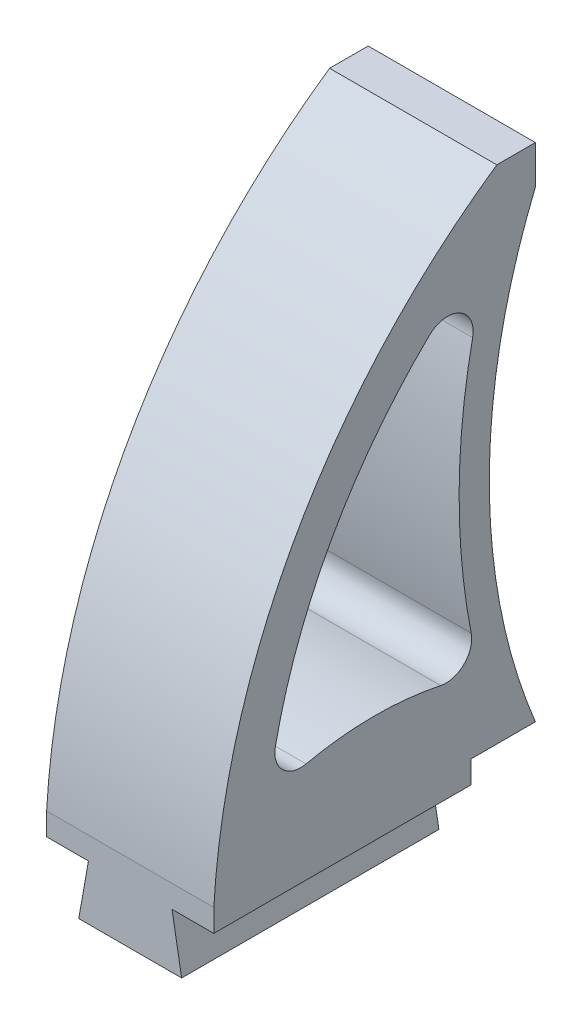
ISO-10303-21;
HEADER;
FILE_DESCRIPTION(('STEP AP214'),'2;1');
FILE_NAME('part.step','',(''),(''),'','','');
FILE_SCHEMA(('AUTOMOTIVE_DESIGN { 1 0 10303 214 1 1 1 1 }'));
ENDSEC;
DATA;
#1=APPLICATION_CONTEXT('core data for automotive mechanical design processes');
#2=APPLICATION_PROTOCOL_DEFINITION('international standard','automotive_design',2000,#1);
#3=PRODUCT_CONTEXT('',#1,'mechanical');
#4=PRODUCT('Part','Part','',(#3));
#5=PRODUCT_RELATED_PRODUCT_CATEGORY('part','',(#4));
#6=PRODUCT_DEFINITION_FORMATION('','',#4);
#7=PRODUCT_DEFINITION_CONTEXT('part definition',#1,'design');
#8=PRODUCT_DEFINITION('design','',#6,#7);
#9=PRODUCT_DEFINITION_SHAPE('','',#8);
#10=(LENGTH_UNIT() NAMED_UNIT(*) SI_UNIT(.MILLI.,.METRE.));
#11=(NAMED_UNIT(*) PLANE_ANGLE_UNIT() SI_UNIT($,.RADIAN.));
#12=(NAMED_UNIT(*) SI_UNIT($,.STERADIAN.) SOLID_ANGLE_UNIT());
#13=UNCERTAINTY_MEASURE_WITH_UNIT(LENGTH_MEASURE(1.E-05),#10,'distance_accuracy_value','');
#14=(GEOMETRIC_REPRESENTATION_CONTEXT(3) GLOBAL_UNCERTAINTY_ASSIGNED_CONTEXT((#13)) GLOBAL_UNIT_ASSIGNED_CONTEXT((#10,
#11,#12)) REPRESENTATION_CONTEXT('',''));
#15=CARTESIAN_POINT('',(0.,0.,0.));
#16=DIRECTION('',(0.,0.,1.));
#17=DIRECTION('',(1.,0.,0.));
#18=AXIS2_PLACEMENT_3D('',#15,#16,#17);
#19=CARTESIAN_POINT('',(6.5,0.,15.7148707184191));
#20=DIRECTION('',(0.,0.,-1.));
#21=DIRECTION('',(-1.,0.,0.));
#22=AXIS2_PLACEMENT_3D('',#19,#20,#21);
#23=PLANE('',#22);
#24=DIRECTION('',(-1.,0.,0.));
#25=VECTOR('',#24,1.);
#26=CARTESIAN_POINT('',(0.,-1.74653863528683,15.7148707184191));
#27=LINE('',#26,#25);
#28=CARTESIAN_POINT('',(6.5,-1.74653863528683,15.7148707184191));
#29=VERTEX_POINT('',#28);
#30=CARTESIAN_POINT('',(3.25,-1.74653863528683,15.7148707184191));
#31=VERTEX_POINT('',#30);
#32=EDGE_CURVE('E220',#29,#31,#27,.T.);
#33=ORIENTED_EDGE('',*,*,#32,.F.);
#34=DIRECTION('',(0.,-1.,0.));
#35=VECTOR('',#34,1.);
#36=CARTESIAN_POINT('',(6.5,0.,15.7148707184191));
#37=LINE('',#36,#35);
#38=CARTESIAN_POINT('',(6.5,0.,15.7148707184191));
#39=VERTEX_POINT('',#38);
#40=EDGE_CURVE('E252',#39,#29,#37,.T.);
#41=ORIENTED_EDGE('',*,*,#40,.F.);
#42=DIRECTION('',(-1.,0.,0.));
#43=VECTOR('',#42,1.);
#44=CARTESIAN_POINT('',(6.5,0.,15.7148707184191));
#45=LINE('',#44,#43);
#46=CARTESIAN_POINT('',(-6.5,0.,15.7148707184191));
#47=VERTEX_POINT('',#46);
#48=EDGE_CURVE('E245',#39,#47,#45,.T.);
#49=ORIENTED_EDGE('',*,*,#48,.T.);
#50=DIRECTION('',(0.,-1.,0.));
#51=VECTOR('',#50,1.);
#52=CARTESIAN_POINT('',(-6.5,0.,15.7148707184191));
#53=LINE('',#52,#51);
#54=CARTESIAN_POINT('',(-6.5,-1.74653863528683,15.7148707184191));
#55=VERTEX_POINT('',#54);
#56=EDGE_CURVE('E267',#47,#55,#53,.T.);
#57=ORIENTED_EDGE('',*,*,#56,.T.);
#58=DIRECTION('',(1.,0.,0.));
#59=VECTOR('',#58,1.);
#60=CARTESIAN_POINT('',(0.,-1.74653863528683,15.7148707184191));
#61=LINE('',#60,#59);
#62=CARTESIAN_POINT('',(-3.25,-1.74653863528683,15.7148707184191));
#63=VERTEX_POINT('',#62);
#64=EDGE_CURVE('E207',#55,#63,#61,.T.);
#65=ORIENTED_EDGE('',*,*,#64,.T.);
#66=DIRECTION('',(-0.173648177666935,-0.984807753012207,0.));
#67=VECTOR('',#66,1.);
#68=CARTESIAN_POINT('',(-2.85332481159478,0.503118149009069,15.7148707184191));
#69=LINE('',#68,#67);
#70=CARTESIAN_POINT('',(-4.,-6.,15.7148707184191));
#71=VERTEX_POINT('',#70);
#72=EDGE_CURVE('E233',#63,#71,#69,.T.);
#73=ORIENTED_EDGE('',*,*,#72,.T.);
#74=DIRECTION('',(-1.,0.,0.));
#75=VECTOR('',#74,1.);
#76=CARTESIAN_POINT('',(6.5,-6.,15.7148707184191));
#77=LINE('',#76,#75);
#78=CARTESIAN_POINT('',(4.,-6.,15.7148707184191));
#79=VERTEX_POINT('',#78);
#80=EDGE_CURVE('E299',#79,#71,#77,.T.);
#81=ORIENTED_EDGE('',*,*,#80,.F.);
#82=DIRECTION('',(0.173648177666935,-0.984807753012207,0.));
#83=VECTOR('',#82,1.);
#84=CARTESIAN_POINT('',(2.85332481159478,0.50311814900907,15.7148707184191));
#85=LINE('',#84,#83);
#86=EDGE_CURVE('E219',#31,#79,#85,.T.);
#87=ORIENTED_EDGE('',*,*,#86,.F.);
#88=EDGE_LOOP('',(#33,#41,#49,#57,#65,#73,#81,#87));
#89=FACE_BOUND('',#88,.T.);
#90=ADVANCED_FACE('F39',(#89),#23,.F.);
#91=CARTESIAN_POINT('',(6.5,-6.,15.7148707184191));
#92=DIRECTION('',(0.,1.,0.));
#93=DIRECTION('',(0.,0.,1.));
#94=AXIS2_PLACEMENT_3D('',#91,#92,#93);
#95=PLANE('',#94);
#96=DIRECTION('',(-1.,0.,0.));
#97=VECTOR('',#96,1.);
#98=CARTESIAN_POINT('',(6.5,-6.,-4.28512928158089));
#99=LINE('',#98,#97);
#100=CARTESIAN_POINT('',(4.,-6.,-4.28512928158089));
#101=VERTEX_POINT('',#100);
#102=CARTESIAN_POINT('',(-4.,-6.,-4.28512928158089));
#103=VERTEX_POINT('',#102);
#104=EDGE_CURVE('E293',#101,#103,#99,.T.);
#105=ORIENTED_EDGE('',*,*,#104,.F.);
#106=DIRECTION('',(0.,0.,1.));
#107=VECTOR('',#106,1.);
#108=CARTESIAN_POINT('',(4.,-6.,-9.28512928158089));
#109=LINE('',#108,#107);
#110=EDGE_CURVE('E230',#101,#79,#109,.T.);
#111=ORIENTED_EDGE('',*,*,#110,.T.);
#112=ORIENTED_EDGE('',*,*,#80,.T.);
#113=DIRECTION('',(0.,0.,1.));
#114=VECTOR('',#113,1.);
#115=CARTESIAN_POINT('',(-4.,-6.,-9.28512928158089));
#116=LINE('',#115,#114);
#117=EDGE_CURVE('E240',#103,#71,#116,.T.);
#118=ORIENTED_EDGE('',*,*,#117,.F.);
#119=EDGE_LOOP('',(#105,#111,#112,#118));
#120=FACE_BOUND('',#119,.T.);
#121=ADVANCED_FACE('F313',(#120),#95,.F.);
#122=CARTESIAN_POINT('',(6.5,-6.,-4.28512928158089));
#123=DIRECTION('',(0.,0.,1.));
#124=DIRECTION('',(1.,0.,0.));
#125=AXIS2_PLACEMENT_3D('',#122,#123,#124);
#126=PLANE('',#125);
#127=DIRECTION('',(0.,1.,0.));
#128=VECTOR('',#127,1.);
#129=CARTESIAN_POINT('',(6.5,-6.,-4.28512928158089));
#130=LINE('',#129,#128);
#131=CARTESIAN_POINT('',(6.5,-1.74653863528683,-4.28512928158089));
#132=VERTEX_POINT('',#131);
#133=CARTESIAN_POINT('',(6.5,0.,-4.28512928158089));
#134=VERTEX_POINT('',#133);
#135=EDGE_CURVE('E258',#132,#134,#130,.T.);
#136=ORIENTED_EDGE('',*,*,#135,.F.);
#137=DIRECTION('',(-1.,0.,0.));
#138=VECTOR('',#137,1.);
#139=CARTESIAN_POINT('',(6.5,-1.74653863528683,-4.28512928158089));
#140=LINE('',#139,#138);
#141=CARTESIAN_POINT('',(3.25,-1.74653863528683,-4.28512928158089));
#142=VERTEX_POINT('',#141);
#143=EDGE_CURVE('E243',#132,#142,#140,.T.);
#144=ORIENTED_EDGE('',*,*,#143,.T.);
#145=DIRECTION('',(0.173648177666935,-0.984807753012207,0.));
#146=VECTOR('',#145,1.);
#147=CARTESIAN_POINT('',(4.07538422401762,-6.4275251791571,-4.28512928158089));
#148=LINE('',#147,#146);
#149=EDGE_CURVE('E11',#142,#101,#148,.T.);
#150=ORIENTED_EDGE('',*,*,#149,.T.);
#151=ORIENTED_EDGE('',*,*,#104,.T.);
#152=DIRECTION('',(-0.173648177666935,-0.984807753012207,0.));
#153=VECTOR('',#152,1.);
#154=CARTESIAN_POINT('',(-3.683386259126,-4.2043942475402,-4.28512928158089));
#155=LINE('',#154,#153);
#156=CARTESIAN_POINT('',(-3.25,-1.74653863528683,-4.28512928158089));
#157=VERTEX_POINT('',#156);
#158=EDGE_CURVE('E50',#157,#103,#155,.T.);
#159=ORIENTED_EDGE('',*,*,#158,.F.);
#160=DIRECTION('',(1.,0.,0.));
#161=VECTOR('',#160,1.);
#162=CARTESIAN_POINT('',(6.5,-1.74653863528683,-4.28512928158089));
#163=LINE('',#162,#161);
#164=CARTESIAN_POINT('',(-6.5,-1.74653863528683,-4.28512928158089));
#165=VERTEX_POINT('',#164);
#166=EDGE_CURVE('E228',#165,#157,#163,.T.);
#167=ORIENTED_EDGE('',*,*,#166,.F.);
#168=DIRECTION('',(0.,1.,0.));
#169=VECTOR('',#168,1.);
#170=CARTESIAN_POINT('',(-6.5,-6.,-4.28512928158089));
#171=LINE('',#170,#169);
#172=CARTESIAN_POINT('',(-6.5,0.,-4.28512928158089));
#173=VERTEX_POINT('',#172);
#174=EDGE_CURVE('E275',#165,#173,#171,.T.);
#175=ORIENTED_EDGE('',*,*,#174,.T.);
#176=DIRECTION('',(-1.,0.,0.));
#177=VECTOR('',#176,1.);
#178=CARTESIAN_POINT('',(6.5,0.,-4.28512928158089));
#179=LINE('',#178,#177);
#180=EDGE_CURVE('E295',#134,#173,#179,.T.);
#181=ORIENTED_EDGE('',*,*,#180,.F.);
#182=EDGE_LOOP('',(#136,#144,#150,#151,#159,#167,#175,#181));
#183=FACE_BOUND('',#182,.T.);
#184=ADVANCED_FACE('F314',(#183),#126,.F.);
#185=CARTESIAN_POINT('',(6.5,-3.,-35.1714929179445));
#186=DIRECTION('',(-1.,0.,0.));
#187=DIRECTION('',(0.,0.,1.));
#188=AXIS2_PLACEMENT_3D('',#185,#186,#187);
#189=CYLINDRICAL_SURFACE('',#188,50.9747192648692);
#190=CARTESIAN_POINT('',(-6.5,-3.,-35.1714929179445));
#191=DIRECTION('',(1.,0.,0.));
#192=DIRECTION('',(0.,0.,-1.));
#193=AXIS2_PLACEMENT_3D('',#190,#191,#192);
#194=CIRCLE('',#193,50.9747192648692);
#195=CARTESIAN_POINT('',(-6.5,39.,-6.28512928158089));
#196=VERTEX_POINT('',#195);
#197=EDGE_CURVE('E249',#196,#47,#194,.T.);
#198=ORIENTED_EDGE('',*,*,#197,.T.);
#199=ORIENTED_EDGE('',*,*,#48,.F.);
#200=CARTESIAN_POINT('',(6.5,-3.,-35.1714929179445));
#201=DIRECTION('',(1.,0.,0.));
#202=DIRECTION('',(0.,0.,-1.));
#203=AXIS2_PLACEMENT_3D('',#200,#201,#202);
#204=CIRCLE('',#203,50.9747192648692);
#205=CARTESIAN_POINT('',(6.5,39.,-6.28512928158089));
#206=VERTEX_POINT('',#205);
#207=EDGE_CURVE('E248',#206,#39,#204,.T.);
#208=ORIENTED_EDGE('',*,*,#207,.F.);
#209=DIRECTION('',(-1.,0.,0.));
#210=VECTOR('',#209,1.);
#211=CARTESIAN_POINT('',(6.5,39.,-6.28512928158089));
#212=LINE('',#211,#210);
#213=EDGE_CURVE('E266',#206,#196,#212,.T.);
#214=ORIENTED_EDGE('',*,*,#213,.T.);
#215=EDGE_LOOP('',(#198,#199,#208,#214));
#216=FACE_BOUND('',#215,.T.);
#217=ADVANCED_FACE('F41',(#216),#189,.T.);
#218=CARTESIAN_POINT('',(6.5,0.,-4.28512928158089));
#219=DIRECTION('',(0.,1.,0.));
#220=DIRECTION('',(0.,0.,1.));
#221=AXIS2_PLACEMENT_3D('',#218,#219,#220);
#222=PLANE('',#221);
#223=DIRECTION('',(0.,0.,-1.));
#224=VECTOR('',#223,1.);
#225=CARTESIAN_POINT('',(-6.5,0.,-4.28512928158089));
#226=LINE('',#225,#224);
#227=CARTESIAN_POINT('',(-6.5,0.,-9.28512928158089));
#228=VERTEX_POINT('',#227);
#229=EDGE_CURVE('E273',#173,#228,#226,.T.);
#230=ORIENTED_EDGE('',*,*,#229,.T.);
#231=DIRECTION('',(-1.,0.,0.));
#232=VECTOR('',#231,1.);
#233=CARTESIAN_POINT('',(6.5,0.,-9.28512928158089));
#234=LINE('',#233,#232);
#235=CARTESIAN_POINT('',(6.5,0.,-9.28512928158089));
#236=VERTEX_POINT('',#235);
#237=EDGE_CURVE('E288',#236,#228,#234,.T.);
#238=ORIENTED_EDGE('',*,*,#237,.F.);
#239=DIRECTION('',(0.,0.,-1.));
#240=VECTOR('',#239,1.);
#241=CARTESIAN_POINT('',(6.5,0.,-4.28512928158089));
#242=LINE('',#241,#240);
#243=EDGE_CURVE('E256',#134,#236,#242,.T.);
#244=ORIENTED_EDGE('',*,*,#243,.F.);
#245=ORIENTED_EDGE('',*,*,#180,.T.);
#246=EDGE_LOOP('',(#230,#238,#244,#245));
#247=FACE_BOUND('',#246,.T.);
#248=ADVANCED_FACE('F334',(#247),#222,.F.);
#249=CARTESIAN_POINT('',(6.5,18.,-52.7017159737657));
#250=DIRECTION('',(-1.,0.,0.));
#251=DIRECTION('',(0.,0.,1.));
#252=AXIS2_PLACEMENT_3D('',#249,#250,#251);
#253=CYLINDRICAL_SURFACE('',#252,47.);
#254=CARTESIAN_POINT('',(-6.5,18.,-52.7017159737657));
#255=DIRECTION('',(-1.,0.,0.));
#256=DIRECTION('',(0.,0.,-1.));
#257=AXIS2_PLACEMENT_3D('',#254,#255,#256);
#258=CIRCLE('',#257,47.);
#259=CARTESIAN_POINT('',(-6.5,36.,-9.28512928158089));
#260=VERTEX_POINT('',#259);
#261=EDGE_CURVE('E277',#228,#260,#258,.T.);
#262=ORIENTED_EDGE('',*,*,#261,.T.);
#263=DIRECTION('',(-1.,0.,0.));
#264=VECTOR('',#263,1.);
#265=CARTESIAN_POINT('',(6.5,36.,-9.28512928158089));
#266=LINE('',#265,#264);
#267=CARTESIAN_POINT('',(6.5,36.,-9.28512928158089));
#268=VERTEX_POINT('',#267);
#269=EDGE_CURVE('E286',#268,#260,#266,.T.);
#270=ORIENTED_EDGE('',*,*,#269,.F.);
#271=CARTESIAN_POINT('',(6.5,18.,-52.7017159737657));
#272=DIRECTION('',(-1.,0.,0.));
#273=DIRECTION('',(0.,0.,-1.));
#274=AXIS2_PLACEMENT_3D('',#271,#272,#273);
#275=CIRCLE('',#274,47.);
#276=EDGE_CURVE('E257',#236,#268,#275,.T.);
#277=ORIENTED_EDGE('',*,*,#276,.F.);
#278=ORIENTED_EDGE('',*,*,#237,.T.);
#279=EDGE_LOOP('',(#262,#270,#277,#278));
#280=FACE_BOUND('',#279,.T.);
#281=ADVANCED_FACE('F354',(#280),#253,.F.);
#282=CARTESIAN_POINT('',(6.5,39.,-9.28512928158089));
#283=DIRECTION('',(0.,0.,1.));
#284=DIRECTION('',(1.,0.,0.));
#285=AXIS2_PLACEMENT_3D('',#282,#283,#284);
#286=PLANE('',#285);
#287=DIRECTION('',(0.,1.,0.));
#288=VECTOR('',#287,1.);
#289=CARTESIAN_POINT('',(-6.5,39.,-9.28512928158089));
#290=LINE('',#289,#288);
#291=CARTESIAN_POINT('',(-6.5,39.,-9.28512928158089));
#292=VERTEX_POINT('',#291);
#293=EDGE_CURVE('E279',#260,#292,#290,.T.);
#294=ORIENTED_EDGE('',*,*,#293,.T.);
#295=DIRECTION('',(-1.,0.,0.));
#296=VECTOR('',#295,1.);
#297=CARTESIAN_POINT('',(6.5,39.,-9.28512928158089));
#298=LINE('',#297,#296);
#299=CARTESIAN_POINT('',(6.5,39.,-9.28512928158089));
#300=VERTEX_POINT('',#299);
#301=EDGE_CURVE('E284',#300,#292,#298,.T.);
#302=ORIENTED_EDGE('',*,*,#301,.F.);
#303=DIRECTION('',(0.,1.,0.));
#304=VECTOR('',#303,1.);
#305=CARTESIAN_POINT('',(6.5,39.,-9.28512928158089));
#306=LINE('',#305,#304);
#307=EDGE_CURVE('E265',#268,#300,#306,.T.);
#308=ORIENTED_EDGE('',*,*,#307,.F.);
#309=ORIENTED_EDGE('',*,*,#269,.T.);
#310=EDGE_LOOP('',(#294,#302,#308,#309));
#311=FACE_BOUND('',#310,.T.);
#312=ADVANCED_FACE('F352',(#311),#286,.F.);
#313=CARTESIAN_POINT('',(6.5,39.,-6.28512928158089));
#314=DIRECTION('',(0.,-1.,0.));
#315=DIRECTION('',(0.,0.,-1.));
#316=AXIS2_PLACEMENT_3D('',#313,#314,#315);
#317=PLANE('',#316);
#318=DIRECTION('',(0.,0.,1.));
#319=VECTOR('',#318,1.);
#320=CARTESIAN_POINT('',(-6.5,39.,-6.28512928158089));
#321=LINE('',#320,#319);
#322=EDGE_CURVE('E251',#292,#196,#321,.T.);
#323=ORIENTED_EDGE('',*,*,#322,.T.);
#324=ORIENTED_EDGE('',*,*,#213,.F.);
#325=DIRECTION('',(0.,0.,1.));
#326=VECTOR('',#325,1.);
#327=CARTESIAN_POINT('',(6.5,39.,-6.28512928158089));
#328=LINE('',#327,#326);
#329=EDGE_CURVE('E262',#300,#206,#328,.T.);
#330=ORIENTED_EDGE('',*,*,#329,.F.);
#331=ORIENTED_EDGE('',*,*,#301,.T.);
#332=EDGE_LOOP('',(#323,#324,#330,#331));
#333=FACE_BOUND('',#332,.T.);
#334=ADVANCED_FACE('F347',(#333),#317,.F.);
#335=CARTESIAN_POINT('',(6.5,-3.,-35.1714929179445));
#336=DIRECTION('',(1.,0.,0.));
#337=DIRECTION('',(0.,0.,-1.));
#338=AXIS2_PLACEMENT_3D('',#335,#336,#337);
#339=PLANE('',#338);
#340=CARTESIAN_POINT('',(6.5,18.1044855795233,-53.3554270520869));
#341=DIRECTION('',(1.,0.,0.));
#342=DIRECTION('',(0.,0.,-1.));
#343=AXIS2_PLACEMENT_3D('',#340,#341,#342);
#344=CIRCLE('',#343,50.);
#345=CARTESIAN_POINT('',(6.5,8.46382033311857,-4.29365401434632));
#346=VERTEX_POINT('',#345);
#347=CARTESIAN_POINT('',(6.5,28.3028962432529,-4.40655147834228));
#348=VERTEX_POINT('',#347);
#349=EDGE_CURVE('E53',#346,#348,#344,.F.);
#350=ORIENTED_EDGE('',*,*,#349,.F.);
#351=CARTESIAN_POINT('',(6.5,8.07819372326239,-2.33118309283669));
#352=DIRECTION('',(1.,0.,0.));
#353=DIRECTION('',(0.,0.,-1.));
#354=AXIS2_PLACEMENT_3D('',#351,#352,#353);
#355=CIRCLE('',#354,2.);
#356=CARTESIAN_POINT('',(6.5,6.12084145223873,-1.92036429200293));
#357=VERTEX_POINT('',#356);
#358=EDGE_CURVE('E184',#357,#346,#355,.T.);
#359=ORIENTED_EDGE('',*,*,#358,.F.);
#360=CARTESIAN_POINT('',(6.5,-18.3460619355571,3.21487071841911));
#361=DIRECTION('',(1.,0.,0.));
#362=DIRECTION('',(0.,0.,-1.));
#363=AXIS2_PLACEMENT_3D('',#360,#361,#362);
#364=CIRCLE('',#363,25.);
#365=CARTESIAN_POINT('',(6.5,6.07909507049784,8.54513386666655));
#366=VERTEX_POINT('',#365);
#367=EDGE_CURVE('E190',#366,#357,#364,.F.);
#368=ORIENTED_EDGE('',*,*,#367,.F.);
#369=CARTESIAN_POINT('',(6.5,8.03310763098224,8.97155491852634));
#370=DIRECTION('',(1.,0.,0.));
#371=DIRECTION('',(0.,0.,-1.));
#372=AXIS2_PLACEMENT_3D('',#369,#370,#371);
#373=CIRCLE('',#372,2.);
#374=CARTESIAN_POINT('',(6.5,8.43997010255349,10.9297333907875));
#375=VERTEX_POINT('',#374);
#376=EDGE_CURVE('E205',#366,#375,#373,.F.);
#377=ORIENTED_EDGE('',*,*,#376,.T.);
#378=CARTESIAN_POINT('',(6.5,-0.104141800442669,-30.1920145266963));
#379=DIRECTION('',(1.,0.,0.));
#380=DIRECTION('',(0.,0.,-1.));
#381=AXIS2_PLACEMENT_3D('',#378,#379,#380);
#382=CIRCLE('',#381,42.);
#383=CARTESIAN_POINT('',(6.5,30.1515813933143,-1.06142555182731));
#384=VERTEX_POINT('',#383);
#385=EDGE_CURVE('E200',#384,#375,#382,.T.);
#386=ORIENTED_EDGE('',*,*,#385,.F.);
#387=CARTESIAN_POINT('',(6.5,28.7108326698021,-2.4485964553925));
#388=DIRECTION('',(1.,0.,0.));
#389=DIRECTION('',(0.,0.,-1.));
#390=AXIS2_PLACEMENT_3D('',#387,#388,#389);
#391=CIRCLE('',#390,2.);
#392=EDGE_CURVE('E197',#348,#384,#391,.T.);
#393=ORIENTED_EDGE('',*,*,#392,.F.);
#394=EDGE_LOOP('',(#350,#359,#368,#377,#386,#393));
#395=FACE_BOUND('',#394,.T.);
#396=DIRECTION('',(0.,0.,1.));
#397=VECTOR('',#396,1.);
#398=CARTESIAN_POINT('',(6.5,-1.74653863528683,-9.28512928158089));
#399=LINE('',#398,#397);
#400=EDGE_CURVE('E221',#132,#29,#399,.T.);
#401=ORIENTED_EDGE('',*,*,#400,.F.);
#402=ORIENTED_EDGE('',*,*,#135,.T.);
#403=ORIENTED_EDGE('',*,*,#243,.T.);
#404=ORIENTED_EDGE('',*,*,#276,.T.);
#405=ORIENTED_EDGE('',*,*,#307,.T.);
#406=ORIENTED_EDGE('',*,*,#329,.T.);
#407=ORIENTED_EDGE('',*,*,#207,.T.);
#408=ORIENTED_EDGE('',*,*,#40,.T.);
#409=EDGE_LOOP('',(#401,#402,#403,#404,#405,#406,#407,#408));
#410=FACE_BOUND('',#409,.T.);
#411=ADVANCED_FACE('F340',(#395,#410),#339,.T.);
#412=CARTESIAN_POINT('',(-6.5,-3.,-35.1714929179445));
#413=DIRECTION('',(1.,0.,0.));
#414=DIRECTION('',(0.,0.,-1.));
#415=AXIS2_PLACEMENT_3D('',#412,#413,#414);
#416=PLANE('',#415);
#417=CARTESIAN_POINT('',(-6.5,8.07819372326239,-2.33118309283669));
#418=DIRECTION('',(1.,0.,0.));
#419=DIRECTION('',(0.,0.,-1.));
#420=AXIS2_PLACEMENT_3D('',#417,#418,#419);
#421=CIRCLE('',#420,2.);
#422=CARTESIAN_POINT('',(-6.5,6.12084145223873,-1.92036429200293));
#423=VERTEX_POINT('',#422);
#424=CARTESIAN_POINT('',(-6.5,8.46382033311857,-4.29365401434632));
#425=VERTEX_POINT('',#424);
#426=EDGE_CURVE('E174',#423,#425,#421,.T.);
#427=ORIENTED_EDGE('',*,*,#426,.T.);
#428=CARTESIAN_POINT('',(-6.5,18.1044855795233,-53.3554270520869));
#429=DIRECTION('',(1.,0.,0.));
#430=DIRECTION('',(0.,0.,-1.));
#431=AXIS2_PLACEMENT_3D('',#428,#429,#430);
#432=CIRCLE('',#431,50.);
#433=CARTESIAN_POINT('',(-6.5,28.3028962432529,-4.40655147834228));
#434=VERTEX_POINT('',#433);
#435=EDGE_CURVE('E170',#425,#434,#432,.F.);
#436=ORIENTED_EDGE('',*,*,#435,.T.);
#437=CARTESIAN_POINT('',(-6.5,28.7108326698021,-2.4485964553925));
#438=DIRECTION('',(1.,0.,0.));
#439=DIRECTION('',(0.,0.,-1.));
#440=AXIS2_PLACEMENT_3D('',#437,#438,#439);
#441=CIRCLE('',#440,2.);
#442=CARTESIAN_POINT('',(-6.5,30.1515813933143,-1.06142555182732));
#443=VERTEX_POINT('',#442);
#444=EDGE_CURVE('E176',#434,#443,#441,.T.);
#445=ORIENTED_EDGE('',*,*,#444,.T.);
#446=CARTESIAN_POINT('',(-6.5,-0.104141800442669,-30.1920145266963));
#447=DIRECTION('',(1.,0.,0.));
#448=DIRECTION('',(0.,0.,-1.));
#449=AXIS2_PLACEMENT_3D('',#446,#447,#448);
#450=CIRCLE('',#449,42.);
#451=CARTESIAN_POINT('',(-6.5,8.43997010255349,10.9297333907875));
#452=VERTEX_POINT('',#451);
#453=EDGE_CURVE('E65',#443,#452,#450,.T.);
#454=ORIENTED_EDGE('',*,*,#453,.T.);
#455=CARTESIAN_POINT('',(-6.5,8.03310763098224,8.97155491852634));
#456=DIRECTION('',(1.,0.,0.));
#457=DIRECTION('',(0.,0.,-1.));
#458=AXIS2_PLACEMENT_3D('',#455,#456,#457);
#459=CIRCLE('',#458,2.);
#460=CARTESIAN_POINT('',(-6.5,6.07909507049784,8.54513386666655));
#461=VERTEX_POINT('',#460);
#462=EDGE_CURVE('E191',#461,#452,#459,.F.);
#463=ORIENTED_EDGE('',*,*,#462,.F.);
#464=CARTESIAN_POINT('',(-6.5,-18.3460619355571,3.21487071841911));
#465=DIRECTION('',(1.,0.,0.));
#466=DIRECTION('',(0.,0.,-1.));
#467=AXIS2_PLACEMENT_3D('',#464,#465,#466);
#468=CIRCLE('',#467,25.);
#469=EDGE_CURVE('E194',#461,#423,#468,.F.);
#470=ORIENTED_EDGE('',*,*,#469,.T.);
#471=EDGE_LOOP('',(#427,#436,#445,#454,#463,#470));
#472=FACE_BOUND('',#471,.T.);
#473=ORIENTED_EDGE('',*,*,#174,.F.);
#474=DIRECTION('',(0.,0.,1.));
#475=VECTOR('',#474,1.);
#476=CARTESIAN_POINT('',(-6.5,-1.74653863528683,-9.28512928158089));
#477=LINE('',#476,#475);
#478=EDGE_CURVE('E227',#165,#55,#477,.T.);
#479=ORIENTED_EDGE('',*,*,#478,.T.);
#480=ORIENTED_EDGE('',*,*,#56,.F.);
#481=ORIENTED_EDGE('',*,*,#197,.F.);
#482=ORIENTED_EDGE('',*,*,#322,.F.);
#483=ORIENTED_EDGE('',*,*,#293,.F.);
#484=ORIENTED_EDGE('',*,*,#261,.F.);
#485=ORIENTED_EDGE('',*,*,#229,.F.);
#486=EDGE_LOOP('',(#473,#479,#480,#481,#482,#483,#484,#485));
#487=FACE_BOUND('',#486,.T.);
#488=ADVANCED_FACE('F180',(#472,#487),#416,.F.);
#489=CARTESIAN_POINT('',(-2.85332481159478,0.503118149009069,-9.28512928158089));
#490=DIRECTION('',(-0.984807753012207,0.173648177666935,0.));
#491=DIRECTION('',(-0.173648177666935,-0.984807753012207,0.));
#492=AXIS2_PLACEMENT_3D('',#489,#490,#491);
#493=PLANE('',#492);
#494=ORIENTED_EDGE('',*,*,#158,.T.);
#495=ORIENTED_EDGE('',*,*,#117,.T.);
#496=ORIENTED_EDGE('',*,*,#72,.F.);
#497=DIRECTION('',(0.,0.,1.));
#498=VECTOR('',#497,1.);
#499=CARTESIAN_POINT('',(-3.25,-1.74653863528683,-9.28512928158089));
#500=LINE('',#499,#498);
#501=EDGE_CURVE('E222',#157,#63,#500,.T.);
#502=ORIENTED_EDGE('',*,*,#501,.F.);
#503=EDGE_LOOP('',(#494,#495,#496,#502));
#504=FACE_BOUND('',#503,.T.);
#505=ADVANCED_FACE('F305',(#504),#493,.T.);
#506=CARTESIAN_POINT('',(0.,-1.74653863528683,-9.28512928158089));
#507=DIRECTION('',(0.,-1.,0.));
#508=DIRECTION('',(1.,0.,0.));
#509=AXIS2_PLACEMENT_3D('',#506,#507,#508);
#510=PLANE('',#509);
#511=ORIENTED_EDGE('',*,*,#166,.T.);
#512=ORIENTED_EDGE('',*,*,#501,.T.);
#513=ORIENTED_EDGE('',*,*,#64,.F.);
#514=ORIENTED_EDGE('',*,*,#478,.F.);
#515=EDGE_LOOP('',(#511,#512,#513,#514));
#516=FACE_BOUND('',#515,.T.);
#517=ADVANCED_FACE('F324',(#516),#510,.T.);
#518=CARTESIAN_POINT('',(2.85332481159478,0.50311814900907,-9.28512928158089));
#519=DIRECTION('',(-0.984807753012207,-0.173648177666935,0.));
#520=DIRECTION('',(0.173648177666935,-0.984807753012207,0.));
#521=AXIS2_PLACEMENT_3D('',#518,#519,#520);
#522=PLANE('',#521);
#523=DIRECTION('',(0.,0.,1.));
#524=VECTOR('',#523,1.);
#525=CARTESIAN_POINT('',(3.25,-1.74653863528683,-9.28512928158089));
#526=LINE('',#525,#524);
#527=EDGE_CURVE('E224',#142,#31,#526,.T.);
#528=ORIENTED_EDGE('',*,*,#527,.T.);
#529=ORIENTED_EDGE('',*,*,#86,.T.);
#530=ORIENTED_EDGE('',*,*,#110,.F.);
#531=ORIENTED_EDGE('',*,*,#149,.F.);
#532=EDGE_LOOP('',(#528,#529,#530,#531));
#533=FACE_BOUND('',#532,.T.);
#534=ADVANCED_FACE('F320',(#533),#522,.F.);
#535=CARTESIAN_POINT('',(0.,-1.74653863528683,-9.28512928158089));
#536=DIRECTION('',(0.,1.,0.));
#537=DIRECTION('',(-1.,0.,0.));
#538=AXIS2_PLACEMENT_3D('',#535,#536,#537);
#539=PLANE('',#538);
#540=ORIENTED_EDGE('',*,*,#400,.T.);
#541=ORIENTED_EDGE('',*,*,#32,.T.);
#542=ORIENTED_EDGE('',*,*,#527,.F.);
#543=ORIENTED_EDGE('',*,*,#143,.F.);
#544=EDGE_LOOP('',(#540,#541,#542,#543));
#545=FACE_BOUND('',#544,.T.);
#546=ADVANCED_FACE('F317',(#545),#539,.F.);
#547=CARTESIAN_POINT('',(-6.5,18.1044855795233,-53.3554270520869));
#548=DIRECTION('',(1.,0.,0.));
#549=DIRECTION('',(0.,0.,-1.));
#550=AXIS2_PLACEMENT_3D('',#547,#548,#549);
#551=CYLINDRICAL_SURFACE('',#550,50.);
#552=ORIENTED_EDGE('',*,*,#349,.T.);
#553=DIRECTION('',(1.,0.,0.));
#554=VECTOR('',#553,1.);
#555=CARTESIAN_POINT('',(-6.5,28.3028962432529,-4.40655147834228));
#556=LINE('',#555,#554);
#557=EDGE_CURVE('E162',#434,#348,#556,.T.);
#558=ORIENTED_EDGE('',*,*,#557,.F.);
#559=ORIENTED_EDGE('',*,*,#435,.F.);
#560=DIRECTION('',(1.,0.,0.));
#561=VECTOR('',#560,1.);
#562=CARTESIAN_POINT('',(-6.5,8.46382033311857,-4.29365401434632));
#563=LINE('',#562,#561);
#564=EDGE_CURVE('E210',#425,#346,#563,.T.);
#565=ORIENTED_EDGE('',*,*,#564,.T.);
#566=EDGE_LOOP('',(#552,#558,#559,#565));
#567=FACE_BOUND('',#566,.T.);
#568=ADVANCED_FACE('F164',(#567),#551,.T.);
#569=CARTESIAN_POINT('',(-6.5,8.07819372326239,-2.33118309283669));
#570=DIRECTION('',(1.,0.,0.));
#571=DIRECTION('',(0.,0.,-1.));
#572=AXIS2_PLACEMENT_3D('',#569,#570,#571);
#573=CYLINDRICAL_SURFACE('',#572,2.);
#574=ORIENTED_EDGE('',*,*,#358,.T.);
#575=ORIENTED_EDGE('',*,*,#564,.F.);
#576=ORIENTED_EDGE('',*,*,#426,.F.);
#577=DIRECTION('',(1.,0.,0.));
#578=VECTOR('',#577,1.);
#579=CARTESIAN_POINT('',(-6.5,6.12084145223873,-1.92036429200293));
#580=LINE('',#579,#578);
#581=EDGE_CURVE('E209',#423,#357,#580,.T.);
#582=ORIENTED_EDGE('',*,*,#581,.T.);
#583=EDGE_LOOP('',(#574,#575,#576,#582));
#584=FACE_BOUND('',#583,.T.);
#585=ADVANCED_FACE('F468',(#584),#573,.F.);
#586=CARTESIAN_POINT('',(-6.5,-18.3460619355571,3.21487071841911));
#587=DIRECTION('',(1.,0.,0.));
#588=DIRECTION('',(0.,0.,-1.));
#589=AXIS2_PLACEMENT_3D('',#586,#587,#588);
#590=CYLINDRICAL_SURFACE('',#589,25.);
#591=ORIENTED_EDGE('',*,*,#367,.T.);
#592=ORIENTED_EDGE('',*,*,#581,.F.);
#593=ORIENTED_EDGE('',*,*,#469,.F.);
#594=DIRECTION('',(1.,0.,0.));
#595=VECTOR('',#594,1.);
#596=CARTESIAN_POINT('',(-6.5,6.07909507049784,8.54513386666655));
#597=LINE('',#596,#595);
#598=EDGE_CURVE('E215',#461,#366,#597,.T.);
#599=ORIENTED_EDGE('',*,*,#598,.T.);
#600=EDGE_LOOP('',(#591,#592,#593,#599));
#601=FACE_BOUND('',#600,.T.);
#602=ADVANCED_FACE('F476',(#601),#590,.T.);
#603=CARTESIAN_POINT('',(-6.5,8.03310763098224,8.97155491852634));
#604=DIRECTION('',(1.,0.,0.));
#605=DIRECTION('',(0.,0.,-1.));
#606=AXIS2_PLACEMENT_3D('',#603,#604,#605);
#607=CYLINDRICAL_SURFACE('',#606,2.);
#608=ORIENTED_EDGE('',*,*,#376,.F.);
#609=ORIENTED_EDGE('',*,*,#598,.F.);
#610=ORIENTED_EDGE('',*,*,#462,.T.);
#611=DIRECTION('',(1.,0.,0.));
#612=VECTOR('',#611,1.);
#613=CARTESIAN_POINT('',(-6.5,8.43997010255349,10.9297333907875));
#614=LINE('',#613,#612);
#615=EDGE_CURVE('E212',#452,#375,#614,.T.);
#616=ORIENTED_EDGE('',*,*,#615,.T.);
#617=EDGE_LOOP('',(#608,#609,#610,#616));
#618=FACE_BOUND('',#617,.T.);
#619=ADVANCED_FACE('F488',(#618),#607,.F.);
#620=CARTESIAN_POINT('',(-6.5,-0.104141800442669,-30.1920145266963));
#621=DIRECTION('',(1.,0.,0.));
#622=DIRECTION('',(0.,0.,-1.));
#623=AXIS2_PLACEMENT_3D('',#620,#621,#622);
#624=CYLINDRICAL_SURFACE('',#623,42.);
#625=ORIENTED_EDGE('',*,*,#385,.T.);
#626=ORIENTED_EDGE('',*,*,#615,.F.);
#627=ORIENTED_EDGE('',*,*,#453,.F.);
#628=DIRECTION('',(1.,0.,0.));
#629=VECTOR('',#628,1.);
#630=CARTESIAN_POINT('',(-6.5,30.1515813933143,-1.06142555182731));
#631=LINE('',#630,#629);
#632=EDGE_CURVE('E175',#443,#384,#631,.T.);
#633=ORIENTED_EDGE('',*,*,#632,.T.);
#634=EDGE_LOOP('',(#625,#626,#627,#633));
#635=FACE_BOUND('',#634,.T.);
#636=ADVANCED_FACE('F499',(#635),#624,.F.);
#637=CARTESIAN_POINT('',(-6.5,28.7108326698021,-2.4485964553925));
#638=DIRECTION('',(1.,0.,0.));
#639=DIRECTION('',(0.,0.,-1.));
#640=AXIS2_PLACEMENT_3D('',#637,#638,#639);
#641=CYLINDRICAL_SURFACE('',#640,2.);
#642=ORIENTED_EDGE('',*,*,#392,.T.);
#643=ORIENTED_EDGE('',*,*,#632,.F.);
#644=ORIENTED_EDGE('',*,*,#444,.F.);
#645=ORIENTED_EDGE('',*,*,#557,.T.);
#646=EDGE_LOOP('',(#642,#643,#644,#645));
#647=FACE_BOUND('',#646,.T.);
#648=ADVANCED_FACE('F177',(#647),#641,.F.);
#649=CLOSED_SHELL('',(#90,#121,#184,#217,#248,#281,#312,#334,#411,#488,#505,#517,#534,#546,#568,
#585,#602,#619,#636,#648));
#650=MANIFOLD_SOLID_BREP('B2',#649);
#651=ADVANCED_BREP_SHAPE_REPRESENTATION('',(#18,#650),#14);
#652=SHAPE_DEFINITION_REPRESENTATION(#9,#651);
ENDSEC;
END-ISO-10303-21;
